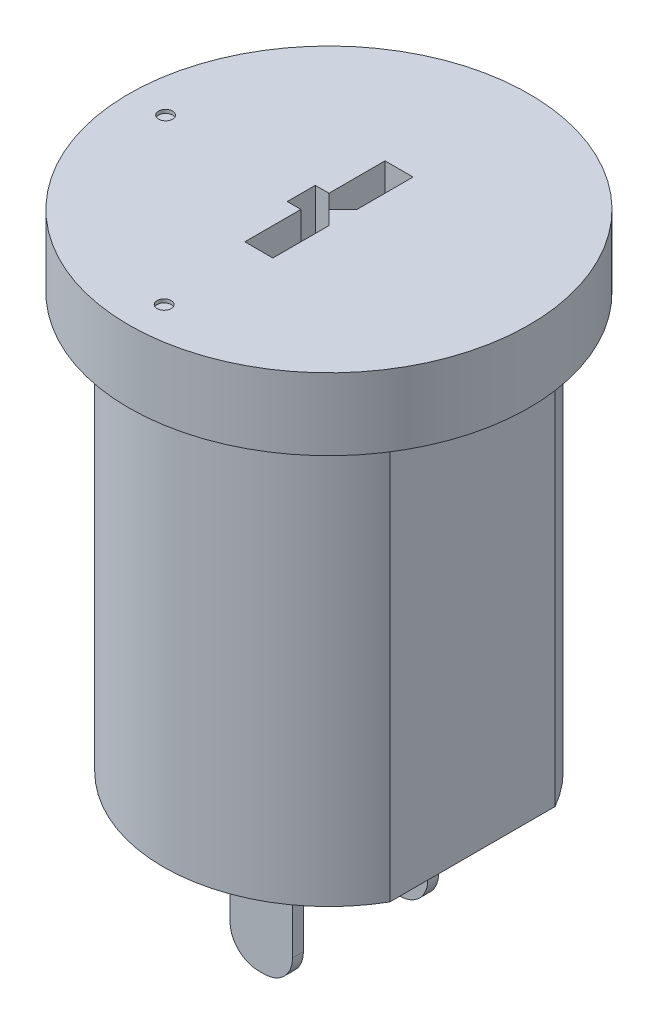
ISO-10303-21;
HEADER;
FILE_DESCRIPTION(('STEP AP214'),'2;1');
FILE_NAME('part.step','',(''),(''),'','','');
FILE_SCHEMA(('AUTOMOTIVE_DESIGN { 1 0 10303 214 1 1 1 1 }'));
ENDSEC;
DATA;
#1=APPLICATION_CONTEXT('core data for automotive mechanical design processes');
#2=APPLICATION_PROTOCOL_DEFINITION('international standard','automotive_design',2000,#1);
#3=PRODUCT_CONTEXT('',#1,'mechanical');
#4=PRODUCT('Part','Part','',(#3));
#5=PRODUCT_RELATED_PRODUCT_CATEGORY('part','',(#4));
#6=PRODUCT_DEFINITION_FORMATION('','',#4);
#7=PRODUCT_DEFINITION_CONTEXT('part definition',#1,'design');
#8=PRODUCT_DEFINITION('design','',#6,#7);
#9=PRODUCT_DEFINITION_SHAPE('','',#8);
#10=(LENGTH_UNIT() NAMED_UNIT(*) SI_UNIT(.MILLI.,.METRE.));
#11=(NAMED_UNIT(*) PLANE_ANGLE_UNIT() SI_UNIT($,.RADIAN.));
#12=(NAMED_UNIT(*) SI_UNIT($,.STERADIAN.) SOLID_ANGLE_UNIT());
#13=UNCERTAINTY_MEASURE_WITH_UNIT(LENGTH_MEASURE(1.E-05),#10,'distance_accuracy_value','');
#14=(GEOMETRIC_REPRESENTATION_CONTEXT(3) GLOBAL_UNCERTAINTY_ASSIGNED_CONTEXT((#13)) GLOBAL_UNIT_ASSIGNED_CONTEXT((#10,
#11,#12)) REPRESENTATION_CONTEXT('',''));
#15=CARTESIAN_POINT('',(0.,0.,0.));
#16=DIRECTION('',(0.,0.,1.));
#17=DIRECTION('',(1.,0.,0.));
#18=AXIS2_PLACEMENT_3D('',#15,#16,#17);
#19=CARTESIAN_POINT('',(-6.,0.,0.));
#20=DIRECTION('',(0.,-1.,0.));
#21=DIRECTION('',(0.,0.,-1.));
#22=AXIS2_PLACEMENT_3D('',#19,#20,#21);
#23=PLANE('',#22);
#24=DIRECTION('',(0.,0.,1.));
#25=VECTOR('',#24,1.);
#26=CARTESIAN_POINT('',(-5.2,0.,0.));
#27=LINE('',#26,#25);
#28=CARTESIAN_POINT('',(-5.2,0.,-2.99332590941915));
#29=VERTEX_POINT('',#28);
#30=CARTESIAN_POINT('',(-5.2,0.,2.99332590941915));
#31=VERTEX_POINT('',#30);
#32=EDGE_CURVE('E465',#29,#31,#27,.T.);
#33=ORIENTED_EDGE('',*,*,#32,.F.);
#34=CARTESIAN_POINT('',(0.,0.,0.));
#35=DIRECTION('',(0.,1.,0.));
#36=DIRECTION('',(0.,0.,1.));
#37=AXIS2_PLACEMENT_3D('',#34,#35,#36);
#38=CIRCLE('',#37,6.);
#39=CARTESIAN_POINT('',(5.2,0.,-2.99332590941915));
#40=VERTEX_POINT('',#39);
#41=EDGE_CURVE('E448',#40,#29,#38,.T.);
#42=ORIENTED_EDGE('',*,*,#41,.F.);
#43=DIRECTION('',(0.,0.,-1.));
#44=VECTOR('',#43,1.);
#45=CARTESIAN_POINT('',(5.2,0.,0.));
#46=LINE('',#45,#44);
#47=CARTESIAN_POINT('',(5.2,0.,2.99332590941915));
#48=VERTEX_POINT('',#47);
#49=EDGE_CURVE('E462',#48,#40,#46,.T.);
#50=ORIENTED_EDGE('',*,*,#49,.F.);
#51=EDGE_CURVE('E444',#31,#48,#38,.T.);
#52=ORIENTED_EDGE('',*,*,#51,.F.);
#53=EDGE_LOOP('',(#33,#42,#50,#52));
#54=FACE_BOUND('',#53,.T.);
#55=DIRECTION('',(-1.,0.,0.));
#56=VECTOR('',#55,1.);
#57=CARTESIAN_POINT('',(-1.1303,0.,2.45));
#58=LINE('',#57,#56);
#59=CARTESIAN_POINT('',(1.1303,0.,2.45));
#60=VERTEX_POINT('',#59);
#61=CARTESIAN_POINT('',(-1.1303,0.,2.45));
#62=VERTEX_POINT('',#61);
#63=EDGE_CURVE('E404',#60,#62,#58,.T.);
#64=ORIENTED_EDGE('',*,*,#63,.F.);
#65=DIRECTION('',(0.,0.,1.));
#66=VECTOR('',#65,1.);
#67=CARTESIAN_POINT('',(1.1303,0.,2.0563));
#68=LINE('',#67,#66);
#69=CARTESIAN_POINT('',(1.1303,0.,2.0563));
#70=VERTEX_POINT('',#69);
#71=EDGE_CURVE('E384',#70,#60,#68,.T.);
#72=ORIENTED_EDGE('',*,*,#71,.F.);
#73=DIRECTION('',(1.,0.,0.));
#74=VECTOR('',#73,1.);
#75=CARTESIAN_POINT('',(-1.1303,0.,2.0563));
#76=LINE('',#75,#74);
#77=CARTESIAN_POINT('',(-1.1303,0.,2.0563));
#78=VERTEX_POINT('',#77);
#79=EDGE_CURVE('E396',#78,#70,#76,.T.);
#80=ORIENTED_EDGE('',*,*,#79,.F.);
#81=DIRECTION('',(0.,0.,-1.));
#82=VECTOR('',#81,1.);
#83=CARTESIAN_POINT('',(-1.1303,0.,2.0563));
#84=LINE('',#83,#82);
#85=EDGE_CURVE('E408',#62,#78,#84,.T.);
#86=ORIENTED_EDGE('',*,*,#85,.F.);
#87=EDGE_LOOP('',(#64,#72,#80,#86));
#88=FACE_BOUND('',#87,.T.);
#89=DIRECTION('',(-1.,0.,0.));
#90=VECTOR('',#89,1.);
#91=CARTESIAN_POINT('',(-1.1303,0.,-2.45));
#92=LINE('',#91,#90);
#93=CARTESIAN_POINT('',(1.1303,0.,-2.45));
#94=VERTEX_POINT('',#93);
#95=CARTESIAN_POINT('',(-1.1303,0.,-2.45));
#96=VERTEX_POINT('',#95);
#97=EDGE_CURVE('E376',#94,#96,#92,.T.);
#98=ORIENTED_EDGE('',*,*,#97,.F.);
#99=DIRECTION('',(0.,0.,1.));
#100=VECTOR('',#99,1.);
#101=CARTESIAN_POINT('',(1.1303,0.,-2.45));
#102=LINE('',#101,#100);
#103=CARTESIAN_POINT('',(1.1303,0.,-2.8437));
#104=VERTEX_POINT('',#103);
#105=EDGE_CURVE('E380',#104,#94,#102,.T.);
#106=ORIENTED_EDGE('',*,*,#105,.F.);
#107=DIRECTION('',(1.,0.,0.));
#108=VECTOR('',#107,1.);
#109=CARTESIAN_POINT('',(-1.1303,0.,-2.8437));
#110=LINE('',#109,#108);
#111=CARTESIAN_POINT('',(-1.1303,0.,-2.8437));
#112=VERTEX_POINT('',#111);
#113=EDGE_CURVE('E367',#112,#104,#110,.T.);
#114=ORIENTED_EDGE('',*,*,#113,.F.);
#115=DIRECTION('',(0.,0.,-1.));
#116=VECTOR('',#115,1.);
#117=CARTESIAN_POINT('',(-1.1303,0.,-2.45));
#118=LINE('',#117,#116);
#119=EDGE_CURVE('E371',#96,#112,#118,.T.);
#120=ORIENTED_EDGE('',*,*,#119,.F.);
#121=EDGE_LOOP('',(#98,#106,#114,#120));
#122=FACE_BOUND('',#121,.T.);
#123=ADVANCED_FACE('F44',(#54,#88,#122),#23,.T.);
#124=CARTESIAN_POINT('',(0.,19.2229077366727,0.));
#125=DIRECTION('',(0.,1.,0.));
#126=DIRECTION('',(0.,0.,1.));
#127=AXIS2_PLACEMENT_3D('',#124,#125,#126);
#128=CYLINDRICAL_SURFACE('',#127,6.);
#129=DIRECTION('',(0.,1.,0.));
#130=VECTOR('',#129,1.);
#131=CARTESIAN_POINT('',(-5.2,19.2229077366727,-2.99332590941915));
#132=LINE('',#131,#130);
#133=CARTESIAN_POINT('',(-5.2,15.0276,-2.99332590941915));
#134=VERTEX_POINT('',#133);
#135=EDGE_CURVE('E441',#134,#29,#132,.F.);
#136=ORIENTED_EDGE('',*,*,#135,.F.);
#137=CARTESIAN_POINT('',(0.,15.0276,0.));
#138=DIRECTION('',(0.,1.,0.));
#139=DIRECTION('',(0.,0.,1.));
#140=AXIS2_PLACEMENT_3D('',#137,#138,#139);
#141=CIRCLE('',#140,6.);
#142=CARTESIAN_POINT('',(5.2,15.0276,-2.99332590941915));
#143=VERTEX_POINT('',#142);
#144=EDGE_CURVE('E453',#143,#134,#141,.T.);
#145=ORIENTED_EDGE('',*,*,#144,.F.);
#146=DIRECTION('',(0.,1.,0.));
#147=VECTOR('',#146,1.);
#148=CARTESIAN_POINT('',(5.2,19.2229077366727,-2.99332590941915));
#149=LINE('',#148,#147);
#150=EDGE_CURVE('E430',#40,#143,#149,.T.);
#151=ORIENTED_EDGE('',*,*,#150,.F.);
#152=ORIENTED_EDGE('',*,*,#41,.T.);
#153=EDGE_LOOP('',(#136,#145,#151,#152));
#154=FACE_BOUND('',#153,.T.);
#155=ADVANCED_FACE('F553',(#154),#128,.T.);
#156=CARTESIAN_POINT('',(0.,17.6276,0.));
#157=DIRECTION('',(0.,1.,0.));
#158=DIRECTION('',(0.,0.,1.));
#159=AXIS2_PLACEMENT_3D('',#156,#157,#158);
#160=PLANE('',#159);
#161=CARTESIAN_POINT('',(-5.91604032043456,17.6276,0.));
#162=DIRECTION('',(0.,1.,0.));
#163=DIRECTION('',(0.,0.,1.));
#164=AXIS2_PLACEMENT_3D('',#161,#162,#163);
#165=CIRCLE('',#164,0.254);
#166=CARTESIAN_POINT('',(-5.91604032043456,17.6276,0.254));
#167=VERTEX_POINT('',#166);
#168=EDGE_CURVE('E1008',#167,#167,#165,.T.);
#169=ORIENTED_EDGE('',*,*,#168,.F.);
#170=EDGE_LOOP('',(#169));
#171=FACE_BOUND('',#170,.T.);
#172=CARTESIAN_POINT('',(0.,17.6276,5.96909897801685));
#173=DIRECTION('',(0.,1.,0.));
#174=DIRECTION('',(0.,0.,1.));
#175=AXIS2_PLACEMENT_3D('',#172,#173,#174);
#176=CIRCLE('',#175,0.254);
#177=CARTESIAN_POINT('',(0.,17.6276,6.22309897801685));
#178=VERTEX_POINT('',#177);
#179=EDGE_CURVE('E1012',#178,#178,#176,.T.);
#180=ORIENTED_EDGE('',*,*,#179,.F.);
#181=EDGE_LOOP('',(#180));
#182=FACE_BOUND('',#181,.T.);
#183=DIRECTION('',(-1.,0.,0.));
#184=VECTOR('',#183,1.);
#185=CARTESIAN_POINT('',(-0.508,17.6276,-2.54));
#186=LINE('',#185,#184);
#187=CARTESIAN_POINT('',(0.508,17.6276,-2.54));
#188=VERTEX_POINT('',#187);
#189=CARTESIAN_POINT('',(-0.508,17.6276,-2.54));
#190=VERTEX_POINT('',#189);
#191=EDGE_CURVE('E60',#188,#190,#186,.T.);
#192=ORIENTED_EDGE('',*,*,#191,.F.);
#193=DIRECTION('',(0.,0.,-1.));
#194=VECTOR('',#193,1.);
#195=CARTESIAN_POINT('',(0.508,17.6276,-2.54));
#196=LINE('',#195,#194);
#197=CARTESIAN_POINT('',(0.508,17.6276,-0.506703338734199));
#198=VERTEX_POINT('',#197);
#199=EDGE_CURVE('E247',#198,#188,#196,.T.);
#200=ORIENTED_EDGE('',*,*,#199,.F.);
#201=DIRECTION('',(0.708009795264266,0.,-0.706202612434882));
#202=VECTOR('',#201,1.);
#203=CARTESIAN_POINT('',(0.508,17.6276,-0.506703338734199));
#204=LINE('',#203,#202);
#205=CARTESIAN_POINT('',(0.,17.6276,0.));
#206=VERTEX_POINT('',#205);
#207=EDGE_CURVE('E251',#206,#198,#204,.T.);
#208=ORIENTED_EDGE('',*,*,#207,.F.);
#209=DIRECTION('',(-0.706202612434882,0.,-0.708009795264266));
#210=VECTOR('',#209,1.);
#211=CARTESIAN_POINT('',(0.,17.6276,0.));
#212=LINE('',#211,#210);
#213=CARTESIAN_POINT('',(0.508,17.6276,0.509299979440973));
#214=VERTEX_POINT('',#213);
#215=EDGE_CURVE('E318',#214,#206,#212,.T.);
#216=ORIENTED_EDGE('',*,*,#215,.F.);
#217=DIRECTION('',(0.,0.,-1.));
#218=VECTOR('',#217,1.);
#219=CARTESIAN_POINT('',(0.508,17.6276,0.509299979440973));
#220=LINE('',#219,#218);
#221=CARTESIAN_POINT('',(0.508,17.6276,2.54));
#222=VERTEX_POINT('',#221);
#223=EDGE_CURVE('E314',#222,#214,#220,.T.);
#224=ORIENTED_EDGE('',*,*,#223,.F.);
#225=DIRECTION('',(1.,0.,0.));
#226=VECTOR('',#225,1.);
#227=CARTESIAN_POINT('',(0.508,17.6276,2.54));
#228=LINE('',#227,#226);
#229=CARTESIAN_POINT('',(-0.508,17.6276,2.54));
#230=VERTEX_POINT('',#229);
#231=EDGE_CURVE('E310',#230,#222,#228,.T.);
#232=ORIENTED_EDGE('',*,*,#231,.F.);
#233=DIRECTION('',(0.,0.,1.));
#234=VECTOR('',#233,1.);
#235=CARTESIAN_POINT('',(-0.508,17.6276,2.54));
#236=LINE('',#235,#234);
#237=CARTESIAN_POINT('',(-0.508,17.6276,0.508));
#238=VERTEX_POINT('',#237);
#239=EDGE_CURVE('E306',#238,#230,#236,.T.);
#240=ORIENTED_EDGE('',*,*,#239,.F.);
#241=DIRECTION('',(1.,0.,0.));
#242=VECTOR('',#241,1.);
#243=CARTESIAN_POINT('',(-0.508,17.6276,0.508));
#244=LINE('',#243,#242);
#245=CARTESIAN_POINT('',(-1.00309196153833,17.6276,0.508));
#246=VERTEX_POINT('',#245);
#247=EDGE_CURVE('E302',#246,#238,#244,.T.);
#248=ORIENTED_EDGE('',*,*,#247,.F.);
#249=DIRECTION('',(0.,0.,1.));
#250=VECTOR('',#249,1.);
#251=CARTESIAN_POINT('',(-1.00309196153833,17.6276,0.508));
#252=LINE('',#251,#250);
#253=CARTESIAN_POINT('',(-1.00309196153833,17.6276,-0.508));
#254=VERTEX_POINT('',#253);
#255=EDGE_CURVE('E298',#254,#246,#252,.T.);
#256=ORIENTED_EDGE('',*,*,#255,.F.);
#257=DIRECTION('',(-1.,0.,0.));
#258=VECTOR('',#257,1.);
#259=CARTESIAN_POINT('',(-1.00309196153833,17.6276,-0.508));
#260=LINE('',#259,#258);
#261=CARTESIAN_POINT('',(-0.508,17.6276,-0.508));
#262=VERTEX_POINT('',#261);
#263=EDGE_CURVE('E294',#262,#254,#260,.T.);
#264=ORIENTED_EDGE('',*,*,#263,.F.);
#265=DIRECTION('',(0.,0.,1.));
#266=VECTOR('',#265,1.);
#267=CARTESIAN_POINT('',(-0.508,17.6276,-0.508));
#268=LINE('',#267,#266);
#269=EDGE_CURVE('E290',#190,#262,#268,.T.);
#270=ORIENTED_EDGE('',*,*,#269,.F.);
#271=EDGE_LOOP('',(#192,#200,#208,#216,#224,#232,#240,#248,#256,#264,#270));
#272=FACE_BOUND('',#271,.T.);
#273=CARTESIAN_POINT('',(0.,17.6276,0.));
#274=DIRECTION('',(0.,1.,0.));
#275=DIRECTION('',(0.,0.,1.));
#276=AXIS2_PLACEMENT_3D('',#273,#274,#275);
#277=CIRCLE('',#276,7.25);
#278=CARTESIAN_POINT('',(0.,17.6276,7.25));
#279=VERTEX_POINT('',#278);
#280=EDGE_CURVE('E458',#279,#279,#277,.T.);
#281=ORIENTED_EDGE('',*,*,#280,.T.);
#282=EDGE_LOOP('',(#281));
#283=FACE_BOUND('',#282,.T.);
#284=ADVANCED_FACE('F559',(#171,#182,#272,#283),#160,.T.);
#285=CARTESIAN_POINT('',(0.,19.2229077366727,0.));
#286=DIRECTION('',(0.,1.,0.));
#287=DIRECTION('',(0.,0.,1.));
#288=AXIS2_PLACEMENT_3D('',#285,#286,#287);
#289=CYLINDRICAL_SURFACE('',#288,7.25);
#290=CARTESIAN_POINT('',(0.,15.0276,0.));
#291=DIRECTION('',(0.,1.,0.));
#292=DIRECTION('',(0.,0.,1.));
#293=AXIS2_PLACEMENT_3D('',#290,#291,#292);
#294=CIRCLE('',#293,7.25);
#295=CARTESIAN_POINT('',(0.,15.0276,7.25));
#296=VERTEX_POINT('',#295);
#297=EDGE_CURVE('E454',#296,#296,#294,.T.);
#298=ORIENTED_EDGE('',*,*,#297,.T.);
#299=EDGE_LOOP('',(#298));
#300=FACE_BOUND('',#299,.T.);
#301=ORIENTED_EDGE('',*,*,#280,.F.);
#302=EDGE_LOOP('',(#301));
#303=FACE_BOUND('',#302,.T.);
#304=ADVANCED_FACE('F571',(#300,#303),#289,.T.);
#305=CARTESIAN_POINT('',(-7.25,15.0276,0.));
#306=DIRECTION('',(0.,-1.,0.));
#307=DIRECTION('',(0.,0.,-1.));
#308=AXIS2_PLACEMENT_3D('',#305,#306,#307);
#309=PLANE('',#308);
#310=ORIENTED_EDGE('',*,*,#144,.T.);
#311=DIRECTION('',(0.,0.,-1.));
#312=VECTOR('',#311,1.);
#313=CARTESIAN_POINT('',(-5.2,15.0276,6.51295021823631));
#314=LINE('',#313,#312);
#315=CARTESIAN_POINT('',(-5.2,15.0276,2.99332590941915));
#316=VERTEX_POINT('',#315);
#317=EDGE_CURVE('E427',#316,#134,#314,.T.);
#318=ORIENTED_EDGE('',*,*,#317,.F.);
#319=CARTESIAN_POINT('',(5.2,15.0276,2.99332590941915));
#320=VERTEX_POINT('',#319);
#321=EDGE_CURVE('E449',#316,#320,#141,.T.);
#322=ORIENTED_EDGE('',*,*,#321,.T.);
#323=DIRECTION('',(0.,0.,1.));
#324=VECTOR('',#323,1.);
#325=CARTESIAN_POINT('',(5.2,15.0276,6.51295021823631));
#326=LINE('',#325,#324);
#327=EDGE_CURVE('E426',#143,#320,#326,.T.);
#328=ORIENTED_EDGE('',*,*,#327,.F.);
#329=EDGE_LOOP('',(#310,#318,#322,#328));
#330=FACE_BOUND('',#329,.T.);
#331=ORIENTED_EDGE('',*,*,#297,.F.);
#332=EDGE_LOOP('',(#331));
#333=FACE_BOUND('',#332,.T.);
#334=ADVANCED_FACE('F567',(#330,#333),#309,.T.);
#335=DIRECTION('',(0.,1.,0.));
#336=VECTOR('',#335,1.);
#337=CARTESIAN_POINT('',(-5.2,19.2229077366727,2.99332590941915));
#338=LINE('',#337,#336);
#339=EDGE_CURVE('E438',#31,#316,#338,.T.);
#340=ORIENTED_EDGE('',*,*,#339,.F.);
#341=ORIENTED_EDGE('',*,*,#51,.T.);
#342=DIRECTION('',(0.,1.,0.));
#343=VECTOR('',#342,1.);
#344=CARTESIAN_POINT('',(5.2,19.2229077366727,2.99332590941915));
#345=LINE('',#344,#343);
#346=EDGE_CURVE('E435',#320,#48,#345,.F.);
#347=ORIENTED_EDGE('',*,*,#346,.F.);
#348=ORIENTED_EDGE('',*,*,#321,.F.);
#349=EDGE_LOOP('',(#340,#341,#347,#348));
#350=FACE_BOUND('',#349,.T.);
#351=ADVANCED_FACE('F562',(#350),#128,.T.);
#352=CARTESIAN_POINT('',(5.2,29.3030537618465,6.51295021823631));
#353=DIRECTION('',(-1.,0.,0.));
#354=DIRECTION('',(0.,0.,1.));
#355=AXIS2_PLACEMENT_3D('',#352,#353,#354);
#356=PLANE('',#355);
#357=ORIENTED_EDGE('',*,*,#346,.T.);
#358=ORIENTED_EDGE('',*,*,#49,.T.);
#359=ORIENTED_EDGE('',*,*,#150,.T.);
#360=ORIENTED_EDGE('',*,*,#327,.T.);
#361=EDGE_LOOP('',(#357,#358,#359,#360));
#362=FACE_BOUND('',#361,.T.);
#363=ADVANCED_FACE('F549',(#362),#356,.F.);
#364=CARTESIAN_POINT('',(-5.2,29.3030537618465,6.51295021823631));
#365=DIRECTION('',(1.,0.,0.));
#366=DIRECTION('',(0.,0.,-1.));
#367=AXIS2_PLACEMENT_3D('',#364,#365,#366);
#368=PLANE('',#367);
#369=ORIENTED_EDGE('',*,*,#135,.T.);
#370=ORIENTED_EDGE('',*,*,#32,.T.);
#371=ORIENTED_EDGE('',*,*,#339,.T.);
#372=ORIENTED_EDGE('',*,*,#317,.T.);
#373=EDGE_LOOP('',(#369,#370,#371,#372));
#374=FACE_BOUND('',#373,.T.);
#375=ADVANCED_FACE('F542',(#374),#368,.F.);
#376=CARTESIAN_POINT('',(1.1303,-5.08,2.0563));
#377=DIRECTION('',(-1.,0.,0.));
#378=DIRECTION('',(0.,0.,1.));
#379=AXIS2_PLACEMENT_3D('',#376,#377,#378);
#380=PLANE('',#379);
#381=DIRECTION('',(0.,1.,0.));
#382=VECTOR('',#381,1.);
#383=CARTESIAN_POINT('',(1.1303,-5.08,2.45));
#384=LINE('',#383,#382);
#385=CARTESIAN_POINT('',(1.1303,-4.064,2.45));
#386=VERTEX_POINT('',#385);
#387=EDGE_CURVE('E423',#386,#60,#384,.T.);
#388=ORIENTED_EDGE('',*,*,#387,.F.);
#389=DIRECTION('',(0.,0.,1.));
#390=VECTOR('',#389,1.);
#391=CARTESIAN_POINT('',(1.1303,-4.064,2.0563));
#392=LINE('',#391,#390);
#393=CARTESIAN_POINT('',(1.1303,-4.064,2.0563));
#394=VERTEX_POINT('',#393);
#395=EDGE_CURVE('E11',#386,#394,#392,.F.);
#396=ORIENTED_EDGE('',*,*,#395,.T.);
#397=DIRECTION('',(0.,1.,0.));
#398=VECTOR('',#397,1.);
#399=CARTESIAN_POINT('',(1.1303,-5.08,2.0563));
#400=LINE('',#399,#398);
#401=EDGE_CURVE('E400',#394,#70,#400,.T.);
#402=ORIENTED_EDGE('',*,*,#401,.T.);
#403=ORIENTED_EDGE('',*,*,#71,.T.);
#404=EDGE_LOOP('',(#388,#396,#402,#403));
#405=FACE_BOUND('',#404,.T.);
#406=ADVANCED_FACE('F540',(#405),#380,.F.);
#407=CARTESIAN_POINT('',(-1.1303,-5.08,2.45));
#408=DIRECTION('',(0.,0.,-1.));
#409=DIRECTION('',(-1.,0.,0.));
#410=AXIS2_PLACEMENT_3D('',#407,#408,#409);
#411=PLANE('',#410);
#412=DIRECTION('',(0.,1.,0.));
#413=VECTOR('',#412,1.);
#414=CARTESIAN_POINT('',(-1.1303,-5.08,2.45));
#415=LINE('',#414,#413);
#416=CARTESIAN_POINT('',(-1.1303,-4.064,2.45));
#417=VERTEX_POINT('',#416);
#418=EDGE_CURVE('E420',#417,#62,#415,.T.);
#419=ORIENTED_EDGE('',*,*,#418,.F.);
#420=CARTESIAN_POINT('',(-0.114300000000001,-4.064,2.45));
#421=DIRECTION('',(0.,0.,-1.));
#422=DIRECTION('',(-1.,0.,0.));
#423=AXIS2_PLACEMENT_3D('',#420,#421,#422);
#424=CIRCLE('',#423,1.016);
#425=CARTESIAN_POINT('',(-0.114300000000001,-5.08,2.45));
#426=VERTEX_POINT('',#425);
#427=EDGE_CURVE('E53',#417,#426,#424,.F.);
#428=ORIENTED_EDGE('',*,*,#427,.T.);
#429=DIRECTION('',(-1.,0.,0.));
#430=VECTOR('',#429,1.);
#431=CARTESIAN_POINT('',(-1.1303,-5.08,2.45));
#432=LINE('',#431,#430);
#433=CARTESIAN_POINT('',(0.114299999999999,-5.08,2.45));
#434=VERTEX_POINT('',#433);
#435=EDGE_CURVE('E391',#434,#426,#432,.T.);
#436=ORIENTED_EDGE('',*,*,#435,.F.);
#437=CARTESIAN_POINT('',(0.114299999999999,-4.064,2.45));
#438=DIRECTION('',(0.,0.,-1.));
#439=DIRECTION('',(-1.,0.,0.));
#440=AXIS2_PLACEMENT_3D('',#437,#438,#439);
#441=CIRCLE('',#440,1.016);
#442=EDGE_CURVE('E68',#434,#386,#441,.F.);
#443=ORIENTED_EDGE('',*,*,#442,.T.);
#444=ORIENTED_EDGE('',*,*,#387,.T.);
#445=ORIENTED_EDGE('',*,*,#63,.T.);
#446=EDGE_LOOP('',(#419,#428,#436,#443,#444,#445));
#447=FACE_BOUND('',#446,.T.);
#448=ADVANCED_FACE('F515',(#447),#411,.F.);
#449=CARTESIAN_POINT('',(-1.1303,-5.08,2.0563));
#450=DIRECTION('',(1.,0.,0.));
#451=DIRECTION('',(0.,0.,-1.));
#452=AXIS2_PLACEMENT_3D('',#449,#450,#451);
#453=PLANE('',#452);
#454=DIRECTION('',(0.,1.,0.));
#455=VECTOR('',#454,1.);
#456=CARTESIAN_POINT('',(-1.1303,-5.08,2.0563));
#457=LINE('',#456,#455);
#458=CARTESIAN_POINT('',(-1.1303,-4.064,2.0563));
#459=VERTEX_POINT('',#458);
#460=EDGE_CURVE('E417',#459,#78,#457,.T.);
#461=ORIENTED_EDGE('',*,*,#460,.F.);
#462=DIRECTION('',(0.,0.,-1.));
#463=VECTOR('',#462,1.);
#464=CARTESIAN_POINT('',(-1.1303,-4.064,2.0563));
#465=LINE('',#464,#463);
#466=EDGE_CURVE('E508',#459,#417,#465,.F.);
#467=ORIENTED_EDGE('',*,*,#466,.T.);
#468=ORIENTED_EDGE('',*,*,#418,.T.);
#469=ORIENTED_EDGE('',*,*,#85,.T.);
#470=EDGE_LOOP('',(#461,#467,#468,#469));
#471=FACE_BOUND('',#470,.T.);
#472=ADVANCED_FACE('F528',(#471),#453,.F.);
#473=CARTESIAN_POINT('',(-1.1303,-5.08,2.0563));
#474=DIRECTION('',(0.,0.,1.));
#475=DIRECTION('',(1.,0.,0.));
#476=AXIS2_PLACEMENT_3D('',#473,#474,#475);
#477=PLANE('',#476);
#478=DIRECTION('',(1.,0.,0.));
#479=VECTOR('',#478,1.);
#480=CARTESIAN_POINT('',(-1.1303,-5.08,2.0563));
#481=LINE('',#480,#479);
#482=CARTESIAN_POINT('',(-0.114300000000001,-5.08,2.0563));
#483=VERTEX_POINT('',#482);
#484=CARTESIAN_POINT('',(0.114299999999999,-5.08,2.0563));
#485=VERTEX_POINT('',#484);
#486=EDGE_CURVE('E395',#483,#485,#481,.T.);
#487=ORIENTED_EDGE('',*,*,#486,.F.);
#488=CARTESIAN_POINT('',(-0.114300000000001,-4.064,2.0563));
#489=DIRECTION('',(0.,0.,1.));
#490=DIRECTION('',(1.,0.,0.));
#491=AXIS2_PLACEMENT_3D('',#488,#489,#490);
#492=CIRCLE('',#491,1.016);
#493=EDGE_CURVE('E505',#483,#459,#492,.F.);
#494=ORIENTED_EDGE('',*,*,#493,.T.);
#495=ORIENTED_EDGE('',*,*,#460,.T.);
#496=ORIENTED_EDGE('',*,*,#79,.T.);
#497=ORIENTED_EDGE('',*,*,#401,.F.);
#498=CARTESIAN_POINT('',(0.114299999999999,-4.064,2.0563));
#499=DIRECTION('',(0.,0.,1.));
#500=DIRECTION('',(1.,0.,0.));
#501=AXIS2_PLACEMENT_3D('',#498,#499,#500);
#502=CIRCLE('',#501,1.016);
#503=EDGE_CURVE('E502',#394,#485,#502,.F.);
#504=ORIENTED_EDGE('',*,*,#503,.T.);
#505=EDGE_LOOP('',(#487,#494,#495,#496,#497,#504));
#506=FACE_BOUND('',#505,.T.);
#507=ADVANCED_FACE('F526',(#506),#477,.F.);
#508=CARTESIAN_POINT('',(0.,-5.08,0.));
#509=DIRECTION('',(0.,1.,0.));
#510=DIRECTION('',(0.,0.,1.));
#511=AXIS2_PLACEMENT_3D('',#508,#509,#510);
#512=PLANE('',#511);
#513=ORIENTED_EDGE('',*,*,#435,.T.);
#514=DIRECTION('',(0.,0.,-1.));
#515=VECTOR('',#514,1.);
#516=CARTESIAN_POINT('',(-0.114300000000001,-5.08,0.));
#517=LINE('',#516,#515);
#518=EDGE_CURVE('E498',#426,#483,#517,.T.);
#519=ORIENTED_EDGE('',*,*,#518,.T.);
#520=ORIENTED_EDGE('',*,*,#486,.T.);
#521=DIRECTION('',(0.,0.,1.));
#522=VECTOR('',#521,1.);
#523=CARTESIAN_POINT('',(0.114299999999999,-5.08,0.));
#524=LINE('',#523,#522);
#525=EDGE_CURVE('E494',#485,#434,#524,.T.);
#526=ORIENTED_EDGE('',*,*,#525,.T.);
#527=EDGE_LOOP('',(#513,#519,#520,#526));
#528=FACE_BOUND('',#527,.T.);
#529=ADVANCED_FACE('F520',(#528),#512,.F.);
#530=CARTESIAN_POINT('',(1.1303,-5.08,-2.45));
#531=DIRECTION('',(-1.,0.,0.));
#532=DIRECTION('',(0.,0.,1.));
#533=AXIS2_PLACEMENT_3D('',#530,#531,#532);
#534=PLANE('',#533);
#535=DIRECTION('',(0.,1.,0.));
#536=VECTOR('',#535,1.);
#537=CARTESIAN_POINT('',(1.1303,-5.08,-2.45));
#538=LINE('',#537,#536);
#539=CARTESIAN_POINT('',(1.1303,-4.064,-2.45));
#540=VERTEX_POINT('',#539);
#541=EDGE_CURVE('E328',#540,#94,#538,.T.);
#542=ORIENTED_EDGE('',*,*,#541,.F.);
#543=DIRECTION('',(0.,0.,1.));
#544=VECTOR('',#543,1.);
#545=CARTESIAN_POINT('',(1.1303,-4.064,-2.8437));
#546=LINE('',#545,#544);
#547=CARTESIAN_POINT('',(1.1303,-4.064,-2.8437));
#548=VERTEX_POINT('',#547);
#549=EDGE_CURVE('E482',#540,#548,#546,.F.);
#550=ORIENTED_EDGE('',*,*,#549,.T.);
#551=DIRECTION('',(0.,1.,0.));
#552=VECTOR('',#551,1.);
#553=CARTESIAN_POINT('',(1.1303,-5.08,-2.8437));
#554=LINE('',#553,#552);
#555=EDGE_CURVE('E363',#548,#104,#554,.T.);
#556=ORIENTED_EDGE('',*,*,#555,.T.);
#557=ORIENTED_EDGE('',*,*,#105,.T.);
#558=EDGE_LOOP('',(#542,#550,#556,#557));
#559=FACE_BOUND('',#558,.T.);
#560=ADVANCED_FACE('F605',(#559),#534,.F.);
#561=CARTESIAN_POINT('',(-1.1303,-5.08,-2.45));
#562=DIRECTION('',(0.,0.,-1.));
#563=DIRECTION('',(-1.,0.,0.));
#564=AXIS2_PLACEMENT_3D('',#561,#562,#563);
#565=PLANE('',#564);
#566=DIRECTION('',(-1.,0.,0.));
#567=VECTOR('',#566,1.);
#568=CARTESIAN_POINT('',(-1.1303,-5.08,-2.45));
#569=LINE('',#568,#567);
#570=CARTESIAN_POINT('',(0.114300000000002,-5.08,-2.45));
#571=VERTEX_POINT('',#570);
#572=CARTESIAN_POINT('',(-0.114299999999998,-5.08,-2.45));
#573=VERTEX_POINT('',#572);
#574=EDGE_CURVE('E372',#571,#573,#569,.T.);
#575=ORIENTED_EDGE('',*,*,#574,.F.);
#576=CARTESIAN_POINT('',(0.114300000000002,-4.064,-2.45));
#577=DIRECTION('',(0.,0.,-1.));
#578=DIRECTION('',(-1.,0.,0.));
#579=AXIS2_PLACEMENT_3D('',#576,#577,#578);
#580=CIRCLE('',#579,1.016);
#581=EDGE_CURVE('E479',#571,#540,#580,.F.);
#582=ORIENTED_EDGE('',*,*,#581,.T.);
#583=ORIENTED_EDGE('',*,*,#541,.T.);
#584=ORIENTED_EDGE('',*,*,#97,.T.);
#585=DIRECTION('',(0.,1.,0.));
#586=VECTOR('',#585,1.);
#587=CARTESIAN_POINT('',(-1.1303,-5.08,-2.45));
#588=LINE('',#587,#586);
#589=CARTESIAN_POINT('',(-1.1303,-4.064,-2.45));
#590=VERTEX_POINT('',#589);
#591=EDGE_CURVE('E357',#590,#96,#588,.T.);
#592=ORIENTED_EDGE('',*,*,#591,.F.);
#593=CARTESIAN_POINT('',(-0.114299999999998,-4.064,-2.45));
#594=DIRECTION('',(0.,0.,-1.));
#595=DIRECTION('',(-1.,0.,0.));
#596=AXIS2_PLACEMENT_3D('',#593,#594,#595);
#597=CIRCLE('',#596,1.016);
#598=EDGE_CURVE('E476',#590,#573,#597,.F.);
#599=ORIENTED_EDGE('',*,*,#598,.T.);
#600=EDGE_LOOP('',(#575,#582,#583,#584,#592,#599));
#601=FACE_BOUND('',#600,.T.);
#602=ADVANCED_FACE('F608',(#601),#565,.F.);
#603=CARTESIAN_POINT('',(-1.1303,-5.08,-2.45));
#604=DIRECTION('',(1.,0.,0.));
#605=DIRECTION('',(0.,0.,-1.));
#606=AXIS2_PLACEMENT_3D('',#603,#604,#605);
#607=PLANE('',#606);
#608=DIRECTION('',(0.,1.,0.));
#609=VECTOR('',#608,1.);
#610=CARTESIAN_POINT('',(-1.1303,-5.08,-2.8437));
#611=LINE('',#610,#609);
#612=CARTESIAN_POINT('',(-1.1303,-4.064,-2.8437));
#613=VERTEX_POINT('',#612);
#614=EDGE_CURVE('E360',#613,#112,#611,.T.);
#615=ORIENTED_EDGE('',*,*,#614,.F.);
#616=DIRECTION('',(0.,0.,-1.));
#617=VECTOR('',#616,1.);
#618=CARTESIAN_POINT('',(-1.1303,-4.064,-2.45));
#619=LINE('',#618,#617);
#620=EDGE_CURVE('E491',#613,#590,#619,.F.);
#621=ORIENTED_EDGE('',*,*,#620,.T.);
#622=ORIENTED_EDGE('',*,*,#591,.T.);
#623=ORIENTED_EDGE('',*,*,#119,.T.);
#624=EDGE_LOOP('',(#615,#621,#622,#623));
#625=FACE_BOUND('',#624,.T.);
#626=ADVANCED_FACE('F612',(#625),#607,.F.);
#627=CARTESIAN_POINT('',(-1.1303,-5.08,-2.8437));
#628=DIRECTION('',(0.,0.,1.));
#629=DIRECTION('',(1.,0.,0.));
#630=AXIS2_PLACEMENT_3D('',#627,#628,#629);
#631=PLANE('',#630);
#632=ORIENTED_EDGE('',*,*,#555,.F.);
#633=CARTESIAN_POINT('',(0.114300000000002,-4.064,-2.8437));
#634=DIRECTION('',(0.,0.,1.));
#635=DIRECTION('',(1.,0.,0.));
#636=AXIS2_PLACEMENT_3D('',#633,#634,#635);
#637=CIRCLE('',#636,1.016);
#638=CARTESIAN_POINT('',(0.114300000000002,-5.08,-2.8437));
#639=VERTEX_POINT('',#638);
#640=EDGE_CURVE('E488',#548,#639,#637,.F.);
#641=ORIENTED_EDGE('',*,*,#640,.T.);
#642=DIRECTION('',(1.,0.,0.));
#643=VECTOR('',#642,1.);
#644=CARTESIAN_POINT('',(-1.1303,-5.08,-2.8437));
#645=LINE('',#644,#643);
#646=CARTESIAN_POINT('',(-0.114299999999998,-5.08,-2.8437));
#647=VERTEX_POINT('',#646);
#648=EDGE_CURVE('E366',#647,#639,#645,.T.);
#649=ORIENTED_EDGE('',*,*,#648,.F.);
#650=CARTESIAN_POINT('',(-0.114299999999998,-4.064,-2.8437));
#651=DIRECTION('',(0.,0.,1.));
#652=DIRECTION('',(1.,0.,0.));
#653=AXIS2_PLACEMENT_3D('',#650,#651,#652);
#654=CIRCLE('',#653,1.016);
#655=EDGE_CURVE('E485',#647,#613,#654,.F.);
#656=ORIENTED_EDGE('',*,*,#655,.T.);
#657=ORIENTED_EDGE('',*,*,#614,.T.);
#658=ORIENTED_EDGE('',*,*,#113,.T.);
#659=EDGE_LOOP('',(#632,#641,#649,#656,#657,#658));
#660=FACE_BOUND('',#659,.T.);
#661=ADVANCED_FACE('F616',(#660),#631,.F.);
#662=CARTESIAN_POINT('',(0.,-5.08,0.));
#663=DIRECTION('',(0.,-1.,0.));
#664=DIRECTION('',(0.,0.,-1.));
#665=AXIS2_PLACEMENT_3D('',#662,#663,#664);
#666=PLANE('',#665);
#667=ORIENTED_EDGE('',*,*,#648,.T.);
#668=DIRECTION('',(0.,0.,1.));
#669=VECTOR('',#668,1.);
#670=CARTESIAN_POINT('',(0.114300000000002,-5.08,-2.45));
#671=LINE('',#670,#669);
#672=EDGE_CURVE('E472',#639,#571,#671,.T.);
#673=ORIENTED_EDGE('',*,*,#672,.T.);
#674=ORIENTED_EDGE('',*,*,#574,.T.);
#675=DIRECTION('',(0.,0.,-1.));
#676=VECTOR('',#675,1.);
#677=CARTESIAN_POINT('',(-0.114299999999998,-5.08,-2.8437));
#678=LINE('',#677,#676);
#679=EDGE_CURVE('E468',#573,#647,#678,.T.);
#680=ORIENTED_EDGE('',*,*,#679,.T.);
#681=EDGE_LOOP('',(#667,#673,#674,#680));
#682=FACE_BOUND('',#681,.T.);
#683=ADVANCED_FACE('F583',(#682),#666,.T.);
#684=CARTESIAN_POINT('',(0.114300000000002,-4.064,0.));
#685=DIRECTION('',(0.,0.,-1.));
#686=DIRECTION('',(-1.,0.,0.));
#687=AXIS2_PLACEMENT_3D('',#684,#685,#686);
#688=CYLINDRICAL_SURFACE('',#687,1.016);
#689=ORIENTED_EDGE('',*,*,#640,.F.);
#690=ORIENTED_EDGE('',*,*,#549,.F.);
#691=ORIENTED_EDGE('',*,*,#581,.F.);
#692=ORIENTED_EDGE('',*,*,#672,.F.);
#693=EDGE_LOOP('',(#689,#690,#691,#692));
#694=FACE_BOUND('',#693,.T.);
#695=ADVANCED_FACE('F579',(#694),#688,.T.);
#696=CARTESIAN_POINT('',(-0.114299999999998,-4.064,0.));
#697=DIRECTION('',(0.,0.,1.));
#698=DIRECTION('',(1.,0.,0.));
#699=AXIS2_PLACEMENT_3D('',#696,#697,#698);
#700=CYLINDRICAL_SURFACE('',#699,1.016);
#701=ORIENTED_EDGE('',*,*,#598,.F.);
#702=ORIENTED_EDGE('',*,*,#620,.F.);
#703=ORIENTED_EDGE('',*,*,#655,.F.);
#704=ORIENTED_EDGE('',*,*,#679,.F.);
#705=EDGE_LOOP('',(#701,#702,#703,#704));
#706=FACE_BOUND('',#705,.T.);
#707=ADVANCED_FACE('F582',(#706),#700,.T.);
#708=CARTESIAN_POINT('',(-0.114300000000001,-4.064,0.));
#709=DIRECTION('',(0.,0.,-1.));
#710=DIRECTION('',(-1.,0.,0.));
#711=AXIS2_PLACEMENT_3D('',#708,#709,#710);
#712=CYLINDRICAL_SURFACE('',#711,1.016);
#713=ORIENTED_EDGE('',*,*,#427,.F.);
#714=ORIENTED_EDGE('',*,*,#466,.F.);
#715=ORIENTED_EDGE('',*,*,#493,.F.);
#716=ORIENTED_EDGE('',*,*,#518,.F.);
#717=EDGE_LOOP('',(#713,#714,#715,#716));
#718=FACE_BOUND('',#717,.T.);
#719=ADVANCED_FACE('F523',(#718),#712,.T.);
#720=CARTESIAN_POINT('',(0.114299999999999,-4.064,0.));
#721=DIRECTION('',(0.,0.,1.));
#722=DIRECTION('',(1.,0.,0.));
#723=AXIS2_PLACEMENT_3D('',#720,#721,#722);
#724=CYLINDRICAL_SURFACE('',#723,1.016);
#725=ORIENTED_EDGE('',*,*,#503,.F.);
#726=ORIENTED_EDGE('',*,*,#395,.F.);
#727=ORIENTED_EDGE('',*,*,#442,.F.);
#728=ORIENTED_EDGE('',*,*,#525,.F.);
#729=EDGE_LOOP('',(#725,#726,#727,#728));
#730=FACE_BOUND('',#729,.T.);
#731=ADVANCED_FACE('F46',(#730),#724,.T.);
#732=CARTESIAN_POINT('',(-0.508,15.0876,-2.54));
#733=DIRECTION('',(0.,0.,-1.));
#734=DIRECTION('',(-1.,0.,0.));
#735=AXIS2_PLACEMENT_3D('',#732,#733,#734);
#736=PLANE('',#735);
#737=ORIENTED_EDGE('',*,*,#191,.T.);
#738=DIRECTION('',(0.,1.,0.));
#739=VECTOR('',#738,1.);
#740=CARTESIAN_POINT('',(-0.508,15.0876,-2.54));
#741=LINE('',#740,#739);
#742=CARTESIAN_POINT('',(-0.508,15.0876,-2.54));
#743=VERTEX_POINT('',#742);
#744=EDGE_CURVE('E221',#743,#190,#741,.T.);
#745=ORIENTED_EDGE('',*,*,#744,.F.);
#746=DIRECTION('',(-1.,0.,0.));
#747=VECTOR('',#746,1.);
#748=CARTESIAN_POINT('',(-0.508,15.0876,-2.54));
#749=LINE('',#748,#747);
#750=CARTESIAN_POINT('',(0.508,15.0876,-2.54));
#751=VERTEX_POINT('',#750);
#752=EDGE_CURVE('E225',#751,#743,#749,.T.);
#753=ORIENTED_EDGE('',*,*,#752,.F.);
#754=DIRECTION('',(0.,1.,0.));
#755=VECTOR('',#754,1.);
#756=CARTESIAN_POINT('',(0.508,15.0876,-2.54));
#757=LINE('',#756,#755);
#758=EDGE_CURVE('E325',#751,#188,#757,.T.);
#759=ORIENTED_EDGE('',*,*,#758,.T.);
#760=EDGE_LOOP('',(#737,#745,#753,#759));
#761=FACE_BOUND('',#760,.T.);
#762=ADVANCED_FACE('F223',(#761),#736,.F.);
#763=CARTESIAN_POINT('',(0.508,15.0876,-2.54));
#764=DIRECTION('',(1.,0.,0.));
#765=DIRECTION('',(0.,0.,-1.));
#766=AXIS2_PLACEMENT_3D('',#763,#764,#765);
#767=PLANE('',#766);
#768=ORIENTED_EDGE('',*,*,#199,.T.);
#769=ORIENTED_EDGE('',*,*,#758,.F.);
#770=DIRECTION('',(0.,0.,-1.));
#771=VECTOR('',#770,1.);
#772=CARTESIAN_POINT('',(0.508,15.0876,-2.54));
#773=LINE('',#772,#771);
#774=CARTESIAN_POINT('',(0.508,15.0876,-0.506703338734199));
#775=VERTEX_POINT('',#774);
#776=EDGE_CURVE('E232',#775,#751,#773,.T.);
#777=ORIENTED_EDGE('',*,*,#776,.F.);
#778=DIRECTION('',(0.,1.,0.));
#779=VECTOR('',#778,1.);
#780=CARTESIAN_POINT('',(0.508,15.0876,-0.506703338734199));
#781=LINE('',#780,#779);
#782=EDGE_CURVE('E329',#775,#198,#781,.T.);
#783=ORIENTED_EDGE('',*,*,#782,.T.);
#784=EDGE_LOOP('',(#768,#769,#777,#783));
#785=FACE_BOUND('',#784,.T.);
#786=ADVANCED_FACE('F594',(#785),#767,.F.);
#787=CARTESIAN_POINT('',(0.508,15.0876,-0.506703338734199));
#788=DIRECTION('',(0.706202612434882,0.,0.708009795264266));
#789=DIRECTION('',(0.708009795264266,0.,-0.706202612434882));
#790=AXIS2_PLACEMENT_3D('',#787,#788,#789);
#791=PLANE('',#790);
#792=ORIENTED_EDGE('',*,*,#207,.T.);
#793=ORIENTED_EDGE('',*,*,#782,.F.);
#794=DIRECTION('',(0.708009795264266,0.,-0.706202612434882));
#795=VECTOR('',#794,1.);
#796=CARTESIAN_POINT('',(0.508,15.0876,-0.506703338734199));
#797=LINE('',#796,#795);
#798=CARTESIAN_POINT('',(0.,15.0876,0.));
#799=VERTEX_POINT('',#798);
#800=EDGE_CURVE('E283',#799,#775,#797,.T.);
#801=ORIENTED_EDGE('',*,*,#800,.F.);
#802=DIRECTION('',(0.,1.,0.));
#803=VECTOR('',#802,1.);
#804=CARTESIAN_POINT('',(0.,15.0876,0.));
#805=LINE('',#804,#803);
#806=EDGE_CURVE('E332',#799,#206,#805,.T.);
#807=ORIENTED_EDGE('',*,*,#806,.T.);
#808=EDGE_LOOP('',(#792,#793,#801,#807));
#809=FACE_BOUND('',#808,.T.);
#810=ADVANCED_FACE('F599',(#809),#791,.F.);
#811=CARTESIAN_POINT('',(0.,15.0876,0.));
#812=DIRECTION('',(0.708009795264266,0.,-0.706202612434882));
#813=DIRECTION('',(-0.706202612434882,0.,-0.708009795264266));
#814=AXIS2_PLACEMENT_3D('',#811,#812,#813);
#815=PLANE('',#814);
#816=ORIENTED_EDGE('',*,*,#215,.T.);
#817=ORIENTED_EDGE('',*,*,#806,.F.);
#818=DIRECTION('',(-0.706202612434882,0.,-0.708009795264266));
#819=VECTOR('',#818,1.);
#820=CARTESIAN_POINT('',(0.,15.0876,0.));
#821=LINE('',#820,#819);
#822=CARTESIAN_POINT('',(0.508,15.0876,0.509299979440973));
#823=VERTEX_POINT('',#822);
#824=EDGE_CURVE('E279',#823,#799,#821,.T.);
#825=ORIENTED_EDGE('',*,*,#824,.F.);
#826=DIRECTION('',(0.,1.,0.));
#827=VECTOR('',#826,1.);
#828=CARTESIAN_POINT('',(0.508,15.0876,0.509299979440973));
#829=LINE('',#828,#827);
#830=EDGE_CURVE('E335',#823,#214,#829,.T.);
#831=ORIENTED_EDGE('',*,*,#830,.T.);
#832=EDGE_LOOP('',(#816,#817,#825,#831));
#833=FACE_BOUND('',#832,.T.);
#834=ADVANCED_FACE('F701',(#833),#815,.F.);
#835=CARTESIAN_POINT('',(0.508,15.0876,0.509299979440973));
#836=DIRECTION('',(1.,0.,0.));
#837=DIRECTION('',(0.,0.,-1.));
#838=AXIS2_PLACEMENT_3D('',#835,#836,#837);
#839=PLANE('',#838);
#840=ORIENTED_EDGE('',*,*,#223,.T.);
#841=ORIENTED_EDGE('',*,*,#830,.F.);
#842=DIRECTION('',(0.,0.,-1.));
#843=VECTOR('',#842,1.);
#844=CARTESIAN_POINT('',(0.508,15.0876,0.509299979440973));
#845=LINE('',#844,#843);
#846=CARTESIAN_POINT('',(0.508,15.0876,2.54));
#847=VERTEX_POINT('',#846);
#848=EDGE_CURVE('E275',#847,#823,#845,.T.);
#849=ORIENTED_EDGE('',*,*,#848,.F.);
#850=DIRECTION('',(0.,1.,0.));
#851=VECTOR('',#850,1.);
#852=CARTESIAN_POINT('',(0.508,15.0876,2.54));
#853=LINE('',#852,#851);
#854=EDGE_CURVE('E338',#847,#222,#853,.T.);
#855=ORIENTED_EDGE('',*,*,#854,.T.);
#856=EDGE_LOOP('',(#840,#841,#849,#855));
#857=FACE_BOUND('',#856,.T.);
#858=ADVANCED_FACE('F712',(#857),#839,.F.);
#859=CARTESIAN_POINT('',(0.508,15.0876,2.54));
#860=DIRECTION('',(0.,0.,1.));
#861=DIRECTION('',(1.,0.,0.));
#862=AXIS2_PLACEMENT_3D('',#859,#860,#861);
#863=PLANE('',#862);
#864=ORIENTED_EDGE('',*,*,#231,.T.);
#865=ORIENTED_EDGE('',*,*,#854,.F.);
#866=DIRECTION('',(1.,0.,0.));
#867=VECTOR('',#866,1.);
#868=CARTESIAN_POINT('',(0.508,15.0876,2.54));
#869=LINE('',#868,#867);
#870=CARTESIAN_POINT('',(-0.508,15.0876,2.54));
#871=VERTEX_POINT('',#870);
#872=EDGE_CURVE('E271',#871,#847,#869,.T.);
#873=ORIENTED_EDGE('',*,*,#872,.F.);
#874=DIRECTION('',(0.,1.,0.));
#875=VECTOR('',#874,1.);
#876=CARTESIAN_POINT('',(-0.508,15.0876,2.54));
#877=LINE('',#876,#875);
#878=EDGE_CURVE('E341',#871,#230,#877,.T.);
#879=ORIENTED_EDGE('',*,*,#878,.T.);
#880=EDGE_LOOP('',(#864,#865,#873,#879));
#881=FACE_BOUND('',#880,.T.);
#882=ADVANCED_FACE('F723',(#881),#863,.F.);
#883=CARTESIAN_POINT('',(-0.508,15.0876,2.54));
#884=DIRECTION('',(-1.,0.,0.));
#885=DIRECTION('',(0.,0.,1.));
#886=AXIS2_PLACEMENT_3D('',#883,#884,#885);
#887=PLANE('',#886);
#888=ORIENTED_EDGE('',*,*,#239,.T.);
#889=ORIENTED_EDGE('',*,*,#878,.F.);
#890=DIRECTION('',(0.,0.,1.));
#891=VECTOR('',#890,1.);
#892=CARTESIAN_POINT('',(-0.508,15.0876,2.54));
#893=LINE('',#892,#891);
#894=CARTESIAN_POINT('',(-0.508,15.0876,0.508));
#895=VERTEX_POINT('',#894);
#896=EDGE_CURVE('E267',#895,#871,#893,.T.);
#897=ORIENTED_EDGE('',*,*,#896,.F.);
#898=DIRECTION('',(0.,1.,0.));
#899=VECTOR('',#898,1.);
#900=CARTESIAN_POINT('',(-0.508,15.0876,0.508));
#901=LINE('',#900,#899);
#902=EDGE_CURVE('E344',#895,#238,#901,.T.);
#903=ORIENTED_EDGE('',*,*,#902,.T.);
#904=EDGE_LOOP('',(#888,#889,#897,#903));
#905=FACE_BOUND('',#904,.T.);
#906=ADVANCED_FACE('F734',(#905),#887,.F.);
#907=CARTESIAN_POINT('',(-0.508,15.0876,0.508));
#908=DIRECTION('',(0.,0.,1.));
#909=DIRECTION('',(1.,0.,0.));
#910=AXIS2_PLACEMENT_3D('',#907,#908,#909);
#911=PLANE('',#910);
#912=ORIENTED_EDGE('',*,*,#247,.T.);
#913=ORIENTED_EDGE('',*,*,#902,.F.);
#914=DIRECTION('',(1.,0.,0.));
#915=VECTOR('',#914,1.);
#916=CARTESIAN_POINT('',(-0.508,15.0876,0.508));
#917=LINE('',#916,#915);
#918=CARTESIAN_POINT('',(-1.00309196153833,15.0876,0.508));
#919=VERTEX_POINT('',#918);
#920=EDGE_CURVE('E263',#919,#895,#917,.T.);
#921=ORIENTED_EDGE('',*,*,#920,.F.);
#922=DIRECTION('',(0.,1.,0.));
#923=VECTOR('',#922,1.);
#924=CARTESIAN_POINT('',(-1.00309196153833,15.0876,0.508));
#925=LINE('',#924,#923);
#926=EDGE_CURVE('E347',#919,#246,#925,.T.);
#927=ORIENTED_EDGE('',*,*,#926,.T.);
#928=EDGE_LOOP('',(#912,#913,#921,#927));
#929=FACE_BOUND('',#928,.T.);
#930=ADVANCED_FACE('F745',(#929),#911,.F.);
#931=CARTESIAN_POINT('',(-1.00309196153833,15.0876,0.508));
#932=DIRECTION('',(-1.,0.,0.));
#933=DIRECTION('',(0.,0.,1.));
#934=AXIS2_PLACEMENT_3D('',#931,#932,#933);
#935=PLANE('',#934);
#936=ORIENTED_EDGE('',*,*,#255,.T.);
#937=ORIENTED_EDGE('',*,*,#926,.F.);
#938=DIRECTION('',(0.,0.,1.));
#939=VECTOR('',#938,1.);
#940=CARTESIAN_POINT('',(-1.00309196153833,15.0876,0.508));
#941=LINE('',#940,#939);
#942=CARTESIAN_POINT('',(-1.00309196153833,15.0876,-0.508));
#943=VERTEX_POINT('',#942);
#944=EDGE_CURVE('E259',#943,#919,#941,.T.);
#945=ORIENTED_EDGE('',*,*,#944,.F.);
#946=DIRECTION('',(0.,1.,0.));
#947=VECTOR('',#946,1.);
#948=CARTESIAN_POINT('',(-1.00309196153833,15.0876,-0.508));
#949=LINE('',#948,#947);
#950=EDGE_CURVE('E350',#943,#254,#949,.T.);
#951=ORIENTED_EDGE('',*,*,#950,.T.);
#952=EDGE_LOOP('',(#936,#937,#945,#951));
#953=FACE_BOUND('',#952,.T.);
#954=ADVANCED_FACE('F756',(#953),#935,.F.);
#955=CARTESIAN_POINT('',(-1.00309196153833,15.0876,-0.508));
#956=DIRECTION('',(0.,0.,-1.));
#957=DIRECTION('',(-1.,0.,0.));
#958=AXIS2_PLACEMENT_3D('',#955,#956,#957);
#959=PLANE('',#958);
#960=ORIENTED_EDGE('',*,*,#263,.T.);
#961=ORIENTED_EDGE('',*,*,#950,.F.);
#962=DIRECTION('',(-1.,0.,0.));
#963=VECTOR('',#962,1.);
#964=CARTESIAN_POINT('',(-1.00309196153833,15.0876,-0.508));
#965=LINE('',#964,#963);
#966=CARTESIAN_POINT('',(-0.508,15.0876,-0.508));
#967=VERTEX_POINT('',#966);
#968=EDGE_CURVE('E241',#967,#943,#965,.T.);
#969=ORIENTED_EDGE('',*,*,#968,.F.);
#970=DIRECTION('',(0.,1.,0.));
#971=VECTOR('',#970,1.);
#972=CARTESIAN_POINT('',(-0.508,15.0876,-0.508));
#973=LINE('',#972,#971);
#974=EDGE_CURVE('E231',#967,#262,#973,.T.);
#975=ORIENTED_EDGE('',*,*,#974,.T.);
#976=EDGE_LOOP('',(#960,#961,#969,#975));
#977=FACE_BOUND('',#976,.T.);
#978=ADVANCED_FACE('F767',(#977),#959,.F.);
#979=CARTESIAN_POINT('',(-0.508,15.0876,-0.508));
#980=DIRECTION('',(-1.,0.,0.));
#981=DIRECTION('',(0.,0.,1.));
#982=AXIS2_PLACEMENT_3D('',#979,#980,#981);
#983=PLANE('',#982);
#984=ORIENTED_EDGE('',*,*,#269,.T.);
#985=ORIENTED_EDGE('',*,*,#974,.F.);
#986=DIRECTION('',(0.,0.,1.));
#987=VECTOR('',#986,1.);
#988=CARTESIAN_POINT('',(-0.508,15.0876,-0.508));
#989=LINE('',#988,#987);
#990=EDGE_CURVE('E235',#743,#967,#989,.T.);
#991=ORIENTED_EDGE('',*,*,#990,.F.);
#992=ORIENTED_EDGE('',*,*,#744,.T.);
#993=EDGE_LOOP('',(#984,#985,#991,#992));
#994=FACE_BOUND('',#993,.T.);
#995=ADVANCED_FACE('F236',(#994),#983,.F.);
#996=CARTESIAN_POINT('',(0.,15.0876,0.));
#997=DIRECTION('',(0.,-1.,0.));
#998=DIRECTION('',(0.,0.,-1.));
#999=AXIS2_PLACEMENT_3D('',#996,#997,#998);
#1000=PLANE('',#999);
#1001=ORIENTED_EDGE('',*,*,#752,.T.);
#1002=ORIENTED_EDGE('',*,*,#990,.T.);
#1003=ORIENTED_EDGE('',*,*,#968,.T.);
#1004=ORIENTED_EDGE('',*,*,#944,.T.);
#1005=ORIENTED_EDGE('',*,*,#920,.T.);
#1006=ORIENTED_EDGE('',*,*,#896,.T.);
#1007=ORIENTED_EDGE('',*,*,#872,.T.);
#1008=ORIENTED_EDGE('',*,*,#848,.T.);
#1009=ORIENTED_EDGE('',*,*,#824,.T.);
#1010=ORIENTED_EDGE('',*,*,#800,.T.);
#1011=ORIENTED_EDGE('',*,*,#776,.T.);
#1012=EDGE_LOOP('',(#1001,#1002,#1003,#1004,#1005,#1006,#1007,#1008,#1009,#1010,#1011));
#1013=FACE_BOUND('',#1012,.T.);
#1014=ADVANCED_FACE('F243',(#1013),#1000,.F.);
#1015=CARTESIAN_POINT('',(0.,17.5006,5.96909897801685));
#1016=DIRECTION('',(0.,1.,0.));
#1017=DIRECTION('',(0.,0.,1.));
#1018=AXIS2_PLACEMENT_3D('',#1015,#1016,#1017);
#1019=CYLINDRICAL_SURFACE('',#1018,0.254);
#1020=CARTESIAN_POINT('',(0.,17.5006,5.96909897801685));
#1021=DIRECTION('',(0.,1.,0.));
#1022=DIRECTION('',(0.,0.,1.));
#1023=AXIS2_PLACEMENT_3D('',#1020,#1021,#1022);
#1024=CIRCLE('',#1023,0.254);
#1025=CARTESIAN_POINT('',(0.,17.5006,6.22309897801685));
#1026=VERTEX_POINT('',#1025);
#1027=EDGE_CURVE('E254',#1026,#1026,#1024,.T.);
#1028=ORIENTED_EDGE('',*,*,#1027,.F.);
#1029=EDGE_LOOP('',(#1028));
#1030=FACE_BOUND('',#1029,.T.);
#1031=ORIENTED_EDGE('',*,*,#179,.T.);
#1032=EDGE_LOOP('',(#1031));
#1033=FACE_BOUND('',#1032,.T.);
#1034=ADVANCED_FACE('F795',(#1030,#1033),#1019,.F.);
#1035=CARTESIAN_POINT('',(0.,17.5006,5.96909897801685));
#1036=DIRECTION('',(0.,1.,0.));
#1037=DIRECTION('',(0.,0.,1.));
#1038=AXIS2_PLACEMENT_3D('',#1035,#1036,#1037);
#1039=PLANE('',#1038);
#1040=ORIENTED_EDGE('',*,*,#1027,.T.);
#1041=EDGE_LOOP('',(#1040));
#1042=FACE_BOUND('',#1041,.T.);
#1043=ADVANCED_FACE('F814',(#1042),#1039,.T.);
#1044=CARTESIAN_POINT('',(-5.91604032043456,17.5006,0.));
#1045=DIRECTION('',(0.,1.,0.));
#1046=DIRECTION('',(0.,0.,1.));
#1047=AXIS2_PLACEMENT_3D('',#1044,#1045,#1046);
#1048=CYLINDRICAL_SURFACE('',#1047,0.254);
#1049=CARTESIAN_POINT('',(-5.91604032043456,17.5006,0.));
#1050=DIRECTION('',(0.,1.,0.));
#1051=DIRECTION('',(0.,0.,1.));
#1052=AXIS2_PLACEMENT_3D('',#1049,#1050,#1051);
#1053=CIRCLE('',#1052,0.254);
#1054=CARTESIAN_POINT('',(-5.91604032043456,17.5006,0.254));
#1055=VERTEX_POINT('',#1054);
#1056=EDGE_CURVE('E291',#1055,#1055,#1053,.T.);
#1057=ORIENTED_EDGE('',*,*,#1056,.F.);
#1058=EDGE_LOOP('',(#1057));
#1059=FACE_BOUND('',#1058,.T.);
#1060=ORIENTED_EDGE('',*,*,#168,.T.);
#1061=EDGE_LOOP('',(#1060));
#1062=FACE_BOUND('',#1061,.T.);
#1063=ADVANCED_FACE('F826',(#1059,#1062),#1048,.F.);
#1064=CARTESIAN_POINT('',(-5.91604032043456,17.5006,0.));
#1065=DIRECTION('',(0.,1.,0.));
#1066=DIRECTION('',(0.,0.,1.));
#1067=AXIS2_PLACEMENT_3D('',#1064,#1065,#1066);
#1068=PLANE('',#1067);
#1069=ORIENTED_EDGE('',*,*,#1056,.T.);
#1070=EDGE_LOOP('',(#1069));
#1071=FACE_BOUND('',#1070,.T.);
#1072=ADVANCED_FACE('F838',(#1071),#1068,.T.);
#1073=CLOSED_SHELL('',(#123,#155,#284,#304,#334,#351,#363,#375,#406,#448,#472,#507,#529,#560,
#602,#626,#661,#683,#695,#707,#719,#731,#762,#786,#810,#834,#858,#882,#906,#930,#954,#978,#995,
#1014,#1034,#1043,#1063,#1072));
#1074=MANIFOLD_SOLID_BREP('B2',#1073);
#1075=ADVANCED_BREP_SHAPE_REPRESENTATION('',(#18,#1074),#14);
#1076=SHAPE_DEFINITION_REPRESENTATION(#9,#1075);
ENDSEC;
END-ISO-10303-21;
